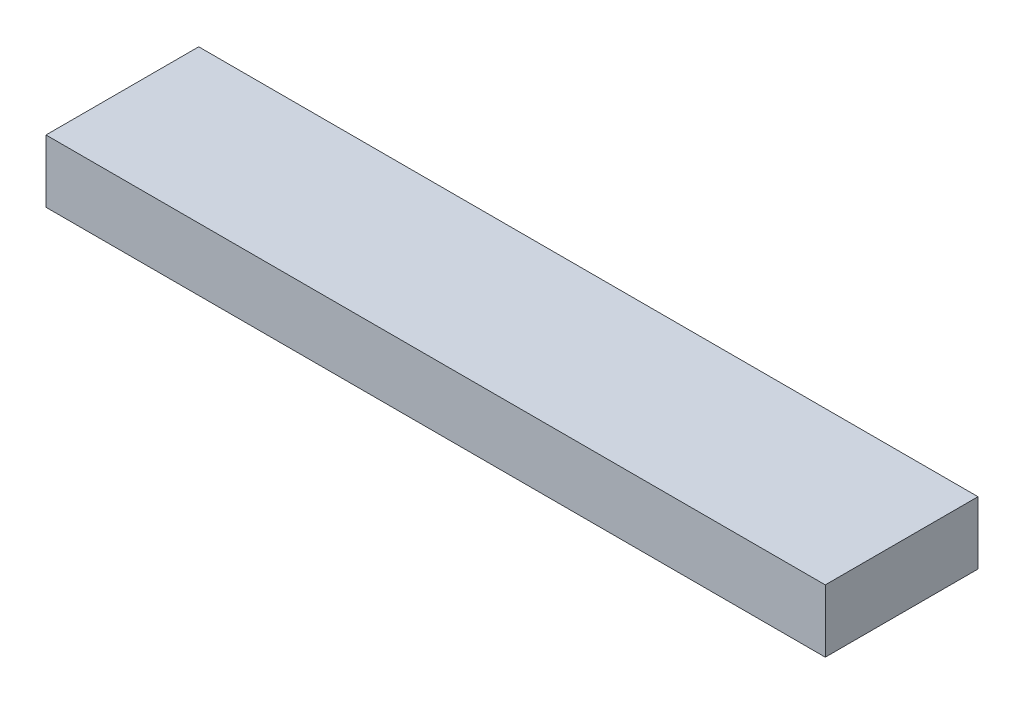
ISO-10303-21;
HEADER;
FILE_DESCRIPTION(('STEP AP214'),'2;1');
FILE_NAME('part.step','',(''),(''),'','','');
FILE_SCHEMA(('AUTOMOTIVE_DESIGN { 1 0 10303 214 1 1 1 1 }'));
ENDSEC;
DATA;
#1=APPLICATION_CONTEXT('core data for automotive mechanical design processes');
#2=APPLICATION_PROTOCOL_DEFINITION('international standard','automotive_design',2000,#1);
#3=PRODUCT_CONTEXT('',#1,'mechanical');
#4=PRODUCT('Part','Part','',(#3));
#5=PRODUCT_RELATED_PRODUCT_CATEGORY('part','',(#4));
#6=PRODUCT_DEFINITION_FORMATION('','',#4);
#7=PRODUCT_DEFINITION_CONTEXT('part definition',#1,'design');
#8=PRODUCT_DEFINITION('design','',#6,#7);
#9=PRODUCT_DEFINITION_SHAPE('','',#8);
#10=(LENGTH_UNIT() NAMED_UNIT(*) SI_UNIT(.MILLI.,.METRE.));
#11=(NAMED_UNIT(*) PLANE_ANGLE_UNIT() SI_UNIT($,.RADIAN.));
#12=(NAMED_UNIT(*) SI_UNIT($,.STERADIAN.) SOLID_ANGLE_UNIT());
#13=UNCERTAINTY_MEASURE_WITH_UNIT(LENGTH_MEASURE(1.E-05),#10,'distance_accuracy_value','');
#14=(GEOMETRIC_REPRESENTATION_CONTEXT(3) GLOBAL_UNCERTAINTY_ASSIGNED_CONTEXT((#13)) GLOBAL_UNIT_ASSIGNED_CONTEXT((#10,
#11,#12)) REPRESENTATION_CONTEXT('',''));
#15=CARTESIAN_POINT('',(0.,0.,0.));
#16=DIRECTION('',(0.,0.,1.));
#17=DIRECTION('',(1.,0.,0.));
#18=AXIS2_PLACEMENT_3D('',#15,#16,#17);
#19=CARTESIAN_POINT('',(19.9,3.2,-3.9));
#20=DIRECTION('',(0.,0.,1.));
#21=DIRECTION('',(1.,0.,0.));
#22=AXIS2_PLACEMENT_3D('',#19,#20,#21);
#23=PLANE('',#22);
#24=DIRECTION('',(-1.,0.,0.));
#25=VECTOR('',#24,1.);
#26=CARTESIAN_POINT('',(19.9,0.,-3.9));
#27=LINE('',#26,#25);
#28=CARTESIAN_POINT('',(19.9,0.,-3.9));
#29=VERTEX_POINT('',#28);
#30=CARTESIAN_POINT('',(-19.9,0.,-3.89999999999999));
#31=VERTEX_POINT('',#30);
#32=EDGE_CURVE('E95',#29,#31,#27,.T.);
#33=ORIENTED_EDGE('',*,*,#32,.T.);
#34=DIRECTION('',(0.,-1.,0.));
#35=VECTOR('',#34,1.);
#36=CARTESIAN_POINT('',(-19.9,3.2,-3.89999999999999));
#37=LINE('',#36,#35);
#38=CARTESIAN_POINT('',(-19.9,3.2,-3.89999999999999));
#39=VERTEX_POINT('',#38);
#40=EDGE_CURVE('E11',#39,#31,#37,.T.);
#41=ORIENTED_EDGE('',*,*,#40,.F.);
#42=DIRECTION('',(-1.,0.,0.));
#43=VECTOR('',#42,1.);
#44=CARTESIAN_POINT('',(19.9,3.2,-3.9));
#45=LINE('',#44,#43);
#46=CARTESIAN_POINT('',(19.9,3.2,-3.9));
#47=VERTEX_POINT('',#46);
#48=EDGE_CURVE('E72',#47,#39,#45,.T.);
#49=ORIENTED_EDGE('',*,*,#48,.F.);
#50=DIRECTION('',(0.,-1.,0.));
#51=VECTOR('',#50,1.);
#52=CARTESIAN_POINT('',(19.9,3.2,-3.9));
#53=LINE('',#52,#51);
#54=EDGE_CURVE('E91',#47,#29,#53,.T.);
#55=ORIENTED_EDGE('',*,*,#54,.T.);
#56=EDGE_LOOP('',(#33,#41,#49,#55));
#57=FACE_BOUND('',#56,.T.);
#58=ADVANCED_FACE('F33',(#57),#23,.F.);
#59=CARTESIAN_POINT('',(-19.9,3.2,3.90000000000001));
#60=DIRECTION('',(-1.,0.,0.));
#61=DIRECTION('',(0.,0.,1.));
#62=AXIS2_PLACEMENT_3D('',#59,#60,#61);
#63=PLANE('',#62);
#64=DIRECTION('',(0.,0.,-1.));
#65=VECTOR('',#64,1.);
#66=CARTESIAN_POINT('',(-19.9,0.,3.90000000000001));
#67=LINE('',#66,#65);
#68=CARTESIAN_POINT('',(-19.9,0.,3.90000000000001));
#69=VERTEX_POINT('',#68);
#70=EDGE_CURVE('E81',#69,#31,#67,.T.);
#71=ORIENTED_EDGE('',*,*,#70,.F.);
#72=DIRECTION('',(0.,-1.,0.));
#73=VECTOR('',#72,1.);
#74=CARTESIAN_POINT('',(-19.9,3.2,3.90000000000001));
#75=LINE('',#74,#73);
#76=CARTESIAN_POINT('',(-19.9,3.2,3.90000000000001));
#77=VERTEX_POINT('',#76);
#78=EDGE_CURVE('E41',#77,#69,#75,.T.);
#79=ORIENTED_EDGE('',*,*,#78,.F.);
#80=DIRECTION('',(0.,0.,-1.));
#81=VECTOR('',#80,1.);
#82=CARTESIAN_POINT('',(-19.9,3.2,3.90000000000001));
#83=LINE('',#82,#81);
#84=EDGE_CURVE('E79',#77,#39,#83,.T.);
#85=ORIENTED_EDGE('',*,*,#84,.T.);
#86=ORIENTED_EDGE('',*,*,#40,.T.);
#87=EDGE_LOOP('',(#71,#79,#85,#86));
#88=FACE_BOUND('',#87,.T.);
#89=ADVANCED_FACE('F78',(#88),#63,.T.);
#90=CARTESIAN_POINT('',(19.9,3.2,3.9));
#91=DIRECTION('',(0.,0.,1.));
#92=DIRECTION('',(1.,0.,0.));
#93=AXIS2_PLACEMENT_3D('',#90,#91,#92);
#94=PLANE('',#93);
#95=DIRECTION('',(-1.,0.,0.));
#96=VECTOR('',#95,1.);
#97=CARTESIAN_POINT('',(19.9,0.,3.9));
#98=LINE('',#97,#96);
#99=CARTESIAN_POINT('',(19.9,0.,3.9));
#100=VERTEX_POINT('',#99);
#101=EDGE_CURVE('E100',#100,#69,#98,.T.);
#102=ORIENTED_EDGE('',*,*,#101,.F.);
#103=DIRECTION('',(0.,-1.,0.));
#104=VECTOR('',#103,1.);
#105=CARTESIAN_POINT('',(19.9,3.2,3.9));
#106=LINE('',#105,#104);
#107=CARTESIAN_POINT('',(19.9,3.2,3.9));
#108=VERTEX_POINT('',#107);
#109=EDGE_CURVE('E64',#108,#100,#106,.T.);
#110=ORIENTED_EDGE('',*,*,#109,.F.);
#111=DIRECTION('',(-1.,0.,0.));
#112=VECTOR('',#111,1.);
#113=CARTESIAN_POINT('',(19.9,3.2,3.9));
#114=LINE('',#113,#112);
#115=EDGE_CURVE('E87',#108,#77,#114,.T.);
#116=ORIENTED_EDGE('',*,*,#115,.T.);
#117=ORIENTED_EDGE('',*,*,#78,.T.);
#118=EDGE_LOOP('',(#102,#110,#116,#117));
#119=FACE_BOUND('',#118,.T.);
#120=ADVANCED_FACE('F89',(#119),#94,.T.);
#121=CARTESIAN_POINT('',(19.9,3.2,3.9));
#122=DIRECTION('',(-1.,0.,0.));
#123=DIRECTION('',(0.,0.,1.));
#124=AXIS2_PLACEMENT_3D('',#121,#122,#123);
#125=PLANE('',#124);
#126=DIRECTION('',(0.,0.,-1.));
#127=VECTOR('',#126,1.);
#128=CARTESIAN_POINT('',(19.9,0.,3.9));
#129=LINE('',#128,#127);
#130=EDGE_CURVE('E67',#100,#29,#129,.T.);
#131=ORIENTED_EDGE('',*,*,#130,.T.);
#132=ORIENTED_EDGE('',*,*,#54,.F.);
#133=DIRECTION('',(0.,0.,-1.));
#134=VECTOR('',#133,1.);
#135=CARTESIAN_POINT('',(19.9,3.2,3.9));
#136=LINE('',#135,#134);
#137=EDGE_CURVE('E49',#108,#47,#136,.T.);
#138=ORIENTED_EDGE('',*,*,#137,.F.);
#139=ORIENTED_EDGE('',*,*,#109,.T.);
#140=EDGE_LOOP('',(#131,#132,#138,#139));
#141=FACE_BOUND('',#140,.T.);
#142=ADVANCED_FACE('F119',(#141),#125,.F.);
#143=CARTESIAN_POINT('',(0.,3.2,0.));
#144=DIRECTION('',(0.,-1.,0.));
#145=DIRECTION('',(0.,0.,-1.));
#146=AXIS2_PLACEMENT_3D('',#143,#144,#145);
#147=PLANE('',#146);
#148=ORIENTED_EDGE('',*,*,#48,.T.);
#149=ORIENTED_EDGE('',*,*,#84,.F.);
#150=ORIENTED_EDGE('',*,*,#115,.F.);
#151=ORIENTED_EDGE('',*,*,#137,.T.);
#152=EDGE_LOOP('',(#148,#149,#150,#151));
#153=FACE_BOUND('',#152,.T.);
#154=ADVANCED_FACE('F86',(#153),#147,.F.);
#155=CARTESIAN_POINT('',(0.,0.,0.));
#156=DIRECTION('',(0.,-1.,0.));
#157=DIRECTION('',(0.,0.,-1.));
#158=AXIS2_PLACEMENT_3D('',#155,#156,#157);
#159=PLANE('',#158);
#160=CARTESIAN_POINT('',(16.,0.,0.));
#161=DIRECTION('',(0.,-1.,0.));
#162=DIRECTION('',(0.,0.,-1.));
#163=AXIS2_PLACEMENT_3D('',#160,#161,#162);
#164=CIRCLE('',#163,2.5);
#165=CARTESIAN_POINT('',(16.,0.,-2.5));
#166=VERTEX_POINT('',#165);
#167=EDGE_CURVE('E246',#166,#166,#164,.T.);
#168=ORIENTED_EDGE('',*,*,#167,.F.);
#169=EDGE_LOOP('',(#168));
#170=FACE_BOUND('',#169,.T.);
#171=CARTESIAN_POINT('',(8.126,0.,0.));
#172=DIRECTION('',(0.,-1.,0.));
#173=DIRECTION('',(0.,0.,-1.));
#174=AXIS2_PLACEMENT_3D('',#171,#172,#173);
#175=CIRCLE('',#174,2.5);
#176=CARTESIAN_POINT('',(8.126,0.,-2.50000000000005));
#177=VERTEX_POINT('',#176);
#178=EDGE_CURVE('E254',#177,#177,#175,.T.);
#179=ORIENTED_EDGE('',*,*,#178,.F.);
#180=EDGE_LOOP('',(#179));
#181=FACE_BOUND('',#180,.T.);
#182=CARTESIAN_POINT('',(0.251999999999999,0.,-1.10835057986192E-13));
#183=DIRECTION('',(0.,-1.,0.));
#184=DIRECTION('',(0.,0.,-1.));
#185=AXIS2_PLACEMENT_3D('',#182,#183,#184);
#186=CIRCLE('',#185,2.5);
#187=CARTESIAN_POINT('',(0.251999999999999,0.,-2.50000000000011));
#188=VERTEX_POINT('',#187);
#189=EDGE_CURVE('E260',#188,#188,#186,.T.);
#190=ORIENTED_EDGE('',*,*,#189,.F.);
#191=EDGE_LOOP('',(#190));
#192=FACE_BOUND('',#191,.T.);
#193=CARTESIAN_POINT('',(-7.622,0.,-1.65818906110293E-13));
#194=DIRECTION('',(0.,-1.,0.));
#195=DIRECTION('',(0.,0.,-1.));
#196=AXIS2_PLACEMENT_3D('',#193,#194,#195);
#197=CIRCLE('',#196,2.5);
#198=CARTESIAN_POINT('',(-7.622,0.,-2.50000000000016));
#199=VERTEX_POINT('',#198);
#200=EDGE_CURVE('E266',#199,#199,#197,.T.);
#201=ORIENTED_EDGE('',*,*,#200,.F.);
#202=EDGE_LOOP('',(#201));
#203=FACE_BOUND('',#202,.T.);
#204=CARTESIAN_POINT('',(-15.496,0.,-2.20802754234395E-13));
#205=DIRECTION('',(0.,-1.,0.));
#206=DIRECTION('',(0.,0.,-1.));
#207=AXIS2_PLACEMENT_3D('',#204,#205,#206);
#208=CIRCLE('',#207,2.5);
#209=CARTESIAN_POINT('',(-15.496,0.,-2.50000000000022));
#210=VERTEX_POINT('',#209);
#211=EDGE_CURVE('E272',#210,#210,#208,.T.);
#212=ORIENTED_EDGE('',*,*,#211,.F.);
#213=EDGE_LOOP('',(#212));
#214=FACE_BOUND('',#213,.T.);
#215=ORIENTED_EDGE('',*,*,#32,.F.);
#216=ORIENTED_EDGE('',*,*,#130,.F.);
#217=ORIENTED_EDGE('',*,*,#101,.T.);
#218=ORIENTED_EDGE('',*,*,#70,.T.);
#219=EDGE_LOOP('',(#215,#216,#217,#218));
#220=FACE_BOUND('',#219,.T.);
#221=ADVANCED_FACE('F107',(#170,#181,#192,#203,#214,#220),#159,.T.);
#222=CARTESIAN_POINT('',(-15.496,1.8,-2.20802754234395E-13));
#223=DIRECTION('',(0.,-1.,0.));
#224=DIRECTION('',(0.,0.,-1.));
#225=AXIS2_PLACEMENT_3D('',#222,#223,#224);
#226=CYLINDRICAL_SURFACE('',#225,2.5);
#227=CARTESIAN_POINT('',(-15.496,1.8,-2.20802754234395E-13));
#228=DIRECTION('',(0.,-1.,0.));
#229=DIRECTION('',(0.,0.,-1.));
#230=AXIS2_PLACEMENT_3D('',#227,#228,#229);
#231=CIRCLE('',#230,2.5);
#232=CARTESIAN_POINT('',(-15.496,1.8,-2.50000000000022));
#233=VERTEX_POINT('',#232);
#234=EDGE_CURVE('E269',#233,#233,#231,.T.);
#235=ORIENTED_EDGE('',*,*,#234,.F.);
#236=EDGE_LOOP('',(#235));
#237=FACE_BOUND('',#236,.T.);
#238=ORIENTED_EDGE('',*,*,#211,.T.);
#239=EDGE_LOOP('',(#238));
#240=FACE_BOUND('',#239,.T.);
#241=ADVANCED_FACE('F109',(#237,#240),#226,.F.);
#242=CARTESIAN_POINT('',(-15.496,1.8,-2.20802754234395E-13));
#243=DIRECTION('',(0.,-1.,0.));
#244=DIRECTION('',(0.,0.,-1.));
#245=AXIS2_PLACEMENT_3D('',#242,#243,#244);
#246=PLANE('',#245);
#247=ORIENTED_EDGE('',*,*,#234,.T.);
#248=EDGE_LOOP('',(#247));
#249=FACE_BOUND('',#248,.T.);
#250=ADVANCED_FACE('F116',(#249),#246,.T.);
#251=CARTESIAN_POINT('',(-7.622,1.8,-1.65818906110293E-13));
#252=DIRECTION('',(0.,-1.,0.));
#253=DIRECTION('',(0.,0.,-1.));
#254=AXIS2_PLACEMENT_3D('',#251,#252,#253);
#255=CYLINDRICAL_SURFACE('',#254,2.5);
#256=CARTESIAN_POINT('',(-7.622,1.8,-1.65818906110293E-13));
#257=DIRECTION('',(0.,-1.,0.));
#258=DIRECTION('',(0.,0.,-1.));
#259=AXIS2_PLACEMENT_3D('',#256,#257,#258);
#260=CIRCLE('',#259,2.5);
#261=CARTESIAN_POINT('',(-7.622,1.8,-2.50000000000016));
#262=VERTEX_POINT('',#261);
#263=EDGE_CURVE('E263',#262,#262,#260,.T.);
#264=ORIENTED_EDGE('',*,*,#263,.F.);
#265=EDGE_LOOP('',(#264));
#266=FACE_BOUND('',#265,.T.);
#267=ORIENTED_EDGE('',*,*,#200,.T.);
#268=EDGE_LOOP('',(#267));
#269=FACE_BOUND('',#268,.T.);
#270=ADVANCED_FACE('F160',(#266,#269),#255,.F.);
#271=CARTESIAN_POINT('',(-7.622,1.8,-1.65818906110293E-13));
#272=DIRECTION('',(0.,-1.,0.));
#273=DIRECTION('',(0.,0.,-1.));
#274=AXIS2_PLACEMENT_3D('',#271,#272,#273);
#275=PLANE('',#274);
#276=ORIENTED_EDGE('',*,*,#263,.T.);
#277=EDGE_LOOP('',(#276));
#278=FACE_BOUND('',#277,.T.);
#279=ADVANCED_FACE('F170',(#278),#275,.T.);
#280=CARTESIAN_POINT('',(0.251999999999999,1.8,-1.10835057986192E-13));
#281=DIRECTION('',(0.,-1.,0.));
#282=DIRECTION('',(0.,0.,-1.));
#283=AXIS2_PLACEMENT_3D('',#280,#281,#282);
#284=CYLINDRICAL_SURFACE('',#283,2.5);
#285=CARTESIAN_POINT('',(0.251999999999999,1.8,-1.10835057986192E-13));
#286=DIRECTION('',(0.,-1.,0.));
#287=DIRECTION('',(0.,0.,-1.));
#288=AXIS2_PLACEMENT_3D('',#285,#286,#287);
#289=CIRCLE('',#288,2.5);
#290=CARTESIAN_POINT('',(0.251999999999999,1.8,-2.50000000000011));
#291=VERTEX_POINT('',#290);
#292=EDGE_CURVE('E257',#291,#291,#289,.T.);
#293=ORIENTED_EDGE('',*,*,#292,.F.);
#294=EDGE_LOOP('',(#293));
#295=FACE_BOUND('',#294,.T.);
#296=ORIENTED_EDGE('',*,*,#189,.T.);
#297=EDGE_LOOP('',(#296));
#298=FACE_BOUND('',#297,.T.);
#299=ADVANCED_FACE('F180',(#295,#298),#284,.F.);
#300=CARTESIAN_POINT('',(0.251999999999999,1.8,-1.10835057986192E-13));
#301=DIRECTION('',(0.,-1.,0.));
#302=DIRECTION('',(0.,0.,-1.));
#303=AXIS2_PLACEMENT_3D('',#300,#301,#302);
#304=PLANE('',#303);
#305=ORIENTED_EDGE('',*,*,#292,.T.);
#306=EDGE_LOOP('',(#305));
#307=FACE_BOUND('',#306,.T.);
#308=ADVANCED_FACE('F190',(#307),#304,.T.);
#309=CARTESIAN_POINT('',(8.126,1.8,0.));
#310=DIRECTION('',(0.,-1.,0.));
#311=DIRECTION('',(0.,0.,-1.));
#312=AXIS2_PLACEMENT_3D('',#309,#310,#311);
#313=CYLINDRICAL_SURFACE('',#312,2.5);
#314=CARTESIAN_POINT('',(8.126,1.8,0.));
#315=DIRECTION('',(0.,-1.,0.));
#316=DIRECTION('',(0.,0.,-1.));
#317=AXIS2_PLACEMENT_3D('',#314,#315,#316);
#318=CIRCLE('',#317,2.5);
#319=CARTESIAN_POINT('',(8.126,1.8,-2.50000000000005));
#320=VERTEX_POINT('',#319);
#321=EDGE_CURVE('E249',#320,#320,#318,.T.);
#322=ORIENTED_EDGE('',*,*,#321,.F.);
#323=EDGE_LOOP('',(#322));
#324=FACE_BOUND('',#323,.T.);
#325=ORIENTED_EDGE('',*,*,#178,.T.);
#326=EDGE_LOOP('',(#325));
#327=FACE_BOUND('',#326,.T.);
#328=ADVANCED_FACE('F200',(#324,#327),#313,.F.);
#329=CARTESIAN_POINT('',(8.126,1.8,0.));
#330=DIRECTION('',(0.,-1.,0.));
#331=DIRECTION('',(0.,0.,-1.));
#332=AXIS2_PLACEMENT_3D('',#329,#330,#331);
#333=PLANE('',#332);
#334=ORIENTED_EDGE('',*,*,#321,.T.);
#335=EDGE_LOOP('',(#334));
#336=FACE_BOUND('',#335,.T.);
#337=ADVANCED_FACE('F210',(#336),#333,.T.);
#338=CARTESIAN_POINT('',(16.,1.8,0.));
#339=DIRECTION('',(0.,-1.,0.));
#340=DIRECTION('',(0.,0.,-1.));
#341=AXIS2_PLACEMENT_3D('',#338,#339,#340);
#342=CYLINDRICAL_SURFACE('',#341,2.5);
#343=CARTESIAN_POINT('',(16.,1.8,0.));
#344=DIRECTION('',(0.,-1.,0.));
#345=DIRECTION('',(0.,0.,-1.));
#346=AXIS2_PLACEMENT_3D('',#343,#344,#345);
#347=CIRCLE('',#346,2.5);
#348=CARTESIAN_POINT('',(16.,1.8,-2.5));
#349=VERTEX_POINT('',#348);
#350=EDGE_CURVE('E98',#349,#349,#347,.T.);
#351=ORIENTED_EDGE('',*,*,#350,.F.);
#352=EDGE_LOOP('',(#351));
#353=FACE_BOUND('',#352,.T.);
#354=ORIENTED_EDGE('',*,*,#167,.T.);
#355=EDGE_LOOP('',(#354));
#356=FACE_BOUND('',#355,.T.);
#357=ADVANCED_FACE('F220',(#353,#356),#342,.F.);
#358=CARTESIAN_POINT('',(16.,1.8,0.));
#359=DIRECTION('',(0.,-1.,0.));
#360=DIRECTION('',(0.,0.,-1.));
#361=AXIS2_PLACEMENT_3D('',#358,#359,#360);
#362=PLANE('',#361);
#363=ORIENTED_EDGE('',*,*,#350,.T.);
#364=EDGE_LOOP('',(#363));
#365=FACE_BOUND('',#364,.T.);
#366=ADVANCED_FACE('F230',(#365),#362,.T.);
#367=CLOSED_SHELL('',(#58,#89,#120,#142,#154,#221,#241,#250,#270,#279,#299,#308,#328,#337,#357,#366));
#368=MANIFOLD_SOLID_BREP('B2',#367);
#369=ADVANCED_BREP_SHAPE_REPRESENTATION('',(#18,#368),#14);
#370=SHAPE_DEFINITION_REPRESENTATION(#9,#369);
ENDSEC;
END-ISO-10303-21;
